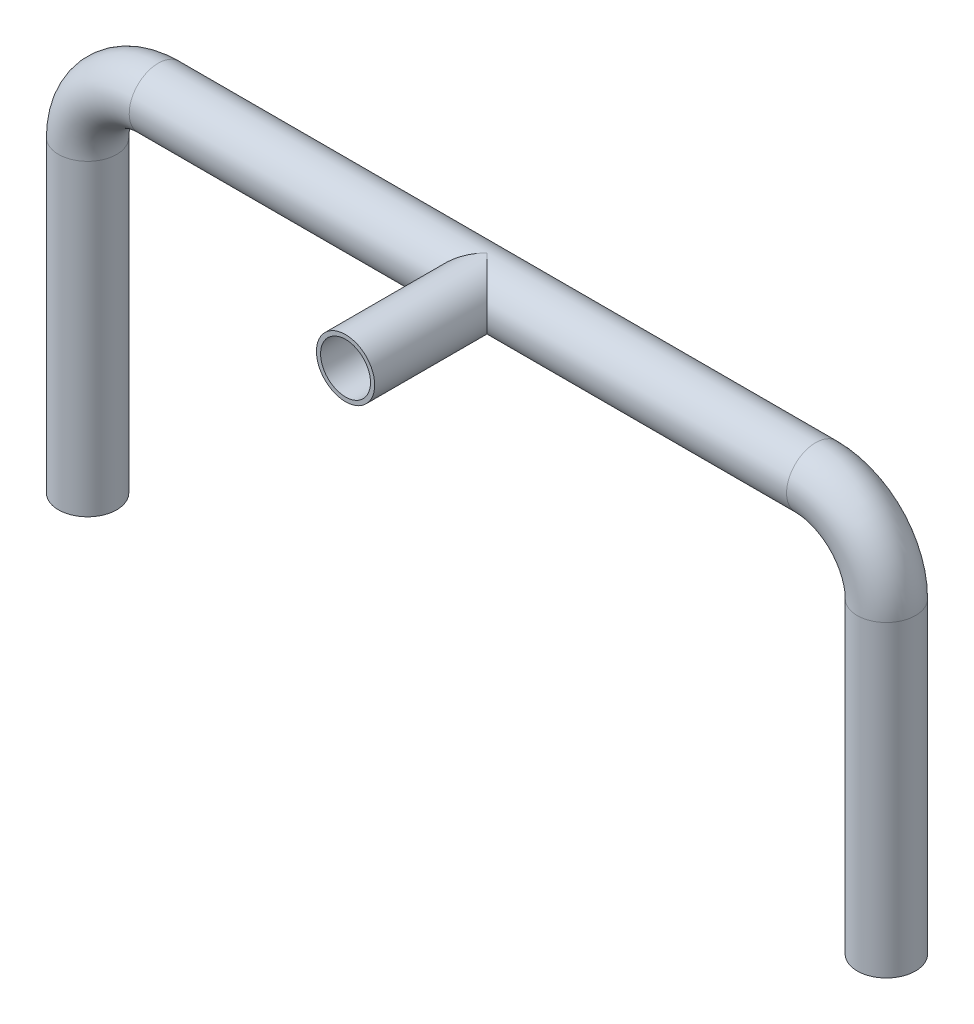
ISO-10303-21;
HEADER;
FILE_DESCRIPTION(('STEP AP214'),'2;1');
FILE_NAME('part.step','',(''),(''),'','','');
FILE_SCHEMA(('AUTOMOTIVE_DESIGN { 1 0 10303 214 1 1 1 1 }'));
ENDSEC;
DATA;
#1=APPLICATION_CONTEXT('core data for automotive mechanical design processes');
#2=APPLICATION_PROTOCOL_DEFINITION('international standard','automotive_design',2000,#1);
#3=PRODUCT_CONTEXT('',#1,'mechanical');
#4=PRODUCT('Part','Part','',(#3));
#5=PRODUCT_RELATED_PRODUCT_CATEGORY('part','',(#4));
#6=PRODUCT_DEFINITION_FORMATION('','',#4);
#7=PRODUCT_DEFINITION_CONTEXT('part definition',#1,'design');
#8=PRODUCT_DEFINITION('design','',#6,#7);
#9=PRODUCT_DEFINITION_SHAPE('','',#8);
#10=(LENGTH_UNIT() NAMED_UNIT(*) SI_UNIT(.MILLI.,.METRE.));
#11=(NAMED_UNIT(*) PLANE_ANGLE_UNIT() SI_UNIT($,.RADIAN.));
#12=(NAMED_UNIT(*) SI_UNIT($,.STERADIAN.) SOLID_ANGLE_UNIT());
#13=UNCERTAINTY_MEASURE_WITH_UNIT(LENGTH_MEASURE(1.E-05),#10,'distance_accuracy_value','');
#14=(GEOMETRIC_REPRESENTATION_CONTEXT(3) GLOBAL_UNCERTAINTY_ASSIGNED_CONTEXT((#13)) GLOBAL_UNIT_ASSIGNED_CONTEXT((#10,
#11,#12)) REPRESENTATION_CONTEXT('',''));
#15=CARTESIAN_POINT('',(0.,0.,0.));
#16=DIRECTION('',(0.,0.,1.));
#17=DIRECTION('',(1.,0.,0.));
#18=AXIS2_PLACEMENT_3D('',#15,#16,#17);
#19=CARTESIAN_POINT('',(0.,0.,0.));
#20=DIRECTION('',(0.,-1.,0.));
#21=DIRECTION('',(0.,0.,1.));
#22=AXIS2_PLACEMENT_3D('',#19,#20,#21);
#23=PLANE('',#22);
#24=CARTESIAN_POINT('',(0.,0.,0.));
#25=DIRECTION('',(0.,-1.,0.));
#26=DIRECTION('',(0.,0.,-1.));
#27=AXIS2_PLACEMENT_3D('',#24,#25,#26);
#28=CIRCLE('',#27,3.);
#29=CARTESIAN_POINT('',(0.,0.,-3.));
#30=VERTEX_POINT('',#29);
#31=EDGE_CURVE('E118',#30,#30,#28,.T.);
#32=ORIENTED_EDGE('',*,*,#31,.F.);
#33=EDGE_LOOP('',(#32));
#34=FACE_BOUND('',#33,.T.);
#35=CARTESIAN_POINT('',(0.,0.,0.));
#36=DIRECTION('',(0.,-1.,0.));
#37=DIRECTION('',(0.,0.,1.));
#38=AXIS2_PLACEMENT_3D('',#35,#36,#37);
#39=CIRCLE('',#38,3.5);
#40=CARTESIAN_POINT('',(0.,0.,3.5));
#41=VERTEX_POINT('',#40);
#42=EDGE_CURVE('E123',#41,#41,#39,.T.);
#43=ORIENTED_EDGE('',*,*,#42,.T.);
#44=EDGE_LOOP('',(#43));
#45=FACE_BOUND('',#44,.T.);
#46=ADVANCED_FACE('F59',(#34,#45),#23,.T.);
#47=CARTESIAN_POINT('',(96.,0.,0.));
#48=DIRECTION('',(0.,1.,0.));
#49=DIRECTION('',(0.,0.,1.));
#50=AXIS2_PLACEMENT_3D('',#47,#48,#49);
#51=PLANE('',#50);
#52=CARTESIAN_POINT('',(96.,0.,0.));
#53=DIRECTION('',(0.,-1.,0.));
#54=DIRECTION('',(0.,0.,-1.));
#55=AXIS2_PLACEMENT_3D('',#52,#53,#54);
#56=CIRCLE('',#55,3.00000000000001);
#57=CARTESIAN_POINT('',(96.,0.,-3.00000000000001));
#58=VERTEX_POINT('',#57);
#59=EDGE_CURVE('E114',#58,#58,#56,.T.);
#60=ORIENTED_EDGE('',*,*,#59,.F.);
#61=EDGE_LOOP('',(#60));
#62=FACE_BOUND('',#61,.T.);
#63=CARTESIAN_POINT('',(96.,0.,0.));
#64=DIRECTION('',(0.,1.,0.));
#65=DIRECTION('',(0.,0.,1.));
#66=AXIS2_PLACEMENT_3D('',#63,#64,#65);
#67=CIRCLE('',#66,3.5);
#68=CARTESIAN_POINT('',(96.,0.,3.5));
#69=VERTEX_POINT('',#68);
#70=EDGE_CURVE('E12',#69,#69,#67,.T.);
#71=ORIENTED_EDGE('',*,*,#70,.F.);
#72=EDGE_LOOP('',(#71));
#73=FACE_BOUND('',#72,.T.);
#74=ADVANCED_FACE('F176',(#62,#73),#51,.F.);
#75=CARTESIAN_POINT('',(0.,0.,0.));
#76=DIRECTION('',(0.,1.,0.));
#77=DIRECTION('',(0.,0.,1.));
#78=AXIS2_PLACEMENT_3D('',#75,#76,#77);
#79=CYLINDRICAL_SURFACE('',#78,3.5);
#80=CARTESIAN_POINT('',(0.,37.,0.));
#81=DIRECTION('',(0.,-1.,0.));
#82=DIRECTION('',(0.,0.,1.));
#83=AXIS2_PLACEMENT_3D('',#80,#81,#82);
#84=CIRCLE('',#83,3.5);
#85=CARTESIAN_POINT('',(-3.5,37.,0.));
#86=VERTEX_POINT('',#85);
#87=EDGE_CURVE('E142',#86,#86,#84,.T.);
#88=ORIENTED_EDGE('',*,*,#87,.T.);
#89=EDGE_LOOP('',(#88));
#90=FACE_BOUND('',#89,.T.);
#91=ORIENTED_EDGE('',*,*,#42,.F.);
#92=EDGE_LOOP('',(#91));
#93=FACE_BOUND('',#92,.T.);
#94=ADVANCED_FACE('F178',(#90,#93),#79,.T.);
#95=CARTESIAN_POINT('',(8.5,37.,0.));
#96=DIRECTION('',(0.,0.,-1.));
#97=DIRECTION('',(-1.,0.,0.));
#98=AXIS2_PLACEMENT_3D('',#95,#96,#97);
#99=TOROIDAL_SURFACE('',#98,8.5,3.5);
#100=CARTESIAN_POINT('',(8.5,45.5,0.));
#101=DIRECTION('',(-1.,0.,0.));
#102=DIRECTION('',(0.,0.,1.));
#103=AXIS2_PLACEMENT_3D('',#100,#101,#102);
#104=CIRCLE('',#103,3.5);
#105=CARTESIAN_POINT('',(8.5,49.,0.));
#106=VERTEX_POINT('',#105);
#107=EDGE_CURVE('E146',#106,#106,#104,.T.);
#108=CARTESIAN_POINT('',(8.5,37.,0.));
#109=DIRECTION('',(0.,0.,-1.));
#110=DIRECTION('',(-1.,0.,0.));
#111=AXIS2_PLACEMENT_3D('',#108,#109,#110);
#112=CIRCLE('',#111,12.);
#113=EDGE_CURVE('',#86,#106,#112,.T.);
#114=ORIENTED_EDGE('',*,*,#87,.F.);
#115=ORIENTED_EDGE('',*,*,#107,.T.);
#116=ORIENTED_EDGE('',*,*,#113,.T.);
#117=ORIENTED_EDGE('',*,*,#113,.F.);
#118=EDGE_LOOP('',(#114,#116,#115,#117));
#119=FACE_BOUND('',#118,.T.);
#120=ADVANCED_FACE('F184',(#119),#99,.T.);
#121=CARTESIAN_POINT('',(8.5,45.5,0.));
#122=DIRECTION('',(1.,0.,0.));
#123=DIRECTION('',(0.,0.,-1.));
#124=AXIS2_PLACEMENT_3D('',#121,#122,#123);
#125=CYLINDRICAL_SURFACE('',#124,3.5);
#126=CARTESIAN_POINT('',(48.,45.5,0.));
#127=DIRECTION('',(0.707106781186547,0.,-0.707106781186547));
#128=DIRECTION('',(0.707106781186547,0.,0.707106781186547));
#129=AXIS2_PLACEMENT_3D('',#126,#127,#128);
#130=ELLIPSE('',#129,4.94974746830584,3.5);
#131=CARTESIAN_POINT('',(48.,49.,0.));
#132=VERTEX_POINT('',#131);
#133=CARTESIAN_POINT('',(48.,42.,0.));
#134=VERTEX_POINT('',#133);
#135=EDGE_CURVE('E106',#132,#134,#130,.T.);
#136=ORIENTED_EDGE('',*,*,#135,.T.);
#137=CARTESIAN_POINT('',(48.,45.5,0.));
#138=DIRECTION('',(0.707106781186547,0.,0.707106781186547));
#139=DIRECTION('',(0.707106781186547,0.,-0.707106781186547));
#140=AXIS2_PLACEMENT_3D('',#137,#138,#139);
#141=ELLIPSE('',#140,4.94974746830584,3.5);
#142=EDGE_CURVE('E80',#134,#132,#141,.F.);
#143=ORIENTED_EDGE('',*,*,#142,.T.);
#144=EDGE_LOOP('',(#136,#143));
#145=FACE_BOUND('',#144,.T.);
#146=CARTESIAN_POINT('',(87.5,45.5,0.));
#147=DIRECTION('',(-1.,0.,0.));
#148=DIRECTION('',(0.,0.,1.));
#149=AXIS2_PLACEMENT_3D('',#146,#147,#148);
#150=CIRCLE('',#149,3.5);
#151=CARTESIAN_POINT('',(87.5,49.,0.));
#152=VERTEX_POINT('',#151);
#153=EDGE_CURVE('E150',#152,#152,#150,.T.);
#154=ORIENTED_EDGE('',*,*,#153,.T.);
#155=EDGE_LOOP('',(#154));
#156=FACE_BOUND('',#155,.T.);
#157=ORIENTED_EDGE('',*,*,#107,.F.);
#158=EDGE_LOOP('',(#157));
#159=FACE_BOUND('',#158,.T.);
#160=ADVANCED_FACE('F173',(#145,#156,#159),#125,.T.);
#161=CARTESIAN_POINT('',(87.5,37.,0.));
#162=DIRECTION('',(0.,0.,-1.));
#163=DIRECTION('',(-1.,0.,0.));
#164=AXIS2_PLACEMENT_3D('',#161,#162,#163);
#165=TOROIDAL_SURFACE('',#164,8.5,3.5);
#166=CARTESIAN_POINT('',(96.,37.,0.));
#167=DIRECTION('',(0.,1.,0.));
#168=DIRECTION('',(0.,0.,1.));
#169=AXIS2_PLACEMENT_3D('',#166,#167,#168);
#170=CIRCLE('',#169,3.5);
#171=CARTESIAN_POINT('',(99.5,37.,0.));
#172=VERTEX_POINT('',#171);
#173=EDGE_CURVE('E67',#172,#172,#170,.T.);
#174=CARTESIAN_POINT('',(87.5,37.,0.));
#175=DIRECTION('',(0.,0.,-1.));
#176=DIRECTION('',(-1.,0.,0.));
#177=AXIS2_PLACEMENT_3D('',#174,#175,#176);
#178=CIRCLE('',#177,12.);
#179=EDGE_CURVE('',#152,#172,#178,.T.);
#180=ORIENTED_EDGE('',*,*,#153,.F.);
#181=ORIENTED_EDGE('',*,*,#173,.T.);
#182=ORIENTED_EDGE('',*,*,#179,.T.);
#183=ORIENTED_EDGE('',*,*,#179,.F.);
#184=EDGE_LOOP('',(#180,#182,#181,#183));
#185=FACE_BOUND('',#184,.T.);
#186=ADVANCED_FACE('F157',(#185),#165,.T.);
#187=CARTESIAN_POINT('',(96.,37.,0.));
#188=DIRECTION('',(0.,-1.,0.));
#189=DIRECTION('',(0.,0.,-1.));
#190=AXIS2_PLACEMENT_3D('',#187,#188,#189);
#191=CYLINDRICAL_SURFACE('',#190,3.5);
#192=ORIENTED_EDGE('',*,*,#70,.T.);
#193=EDGE_LOOP('',(#192));
#194=FACE_BOUND('',#193,.T.);
#195=ORIENTED_EDGE('',*,*,#173,.F.);
#196=EDGE_LOOP('',(#195));
#197=FACE_BOUND('',#196,.T.);
#198=ADVANCED_FACE('F160',(#194,#197),#191,.T.);
#199=CARTESIAN_POINT('',(0.,0.,0.));
#200=DIRECTION('',(0.,1.,0.));
#201=DIRECTION('',(0.,0.,1.));
#202=AXIS2_PLACEMENT_3D('',#199,#200,#201);
#203=CYLINDRICAL_SURFACE('',#202,3.);
#204=CARTESIAN_POINT('',(0.,37.,0.));
#205=DIRECTION('',(0.,1.,0.));
#206=DIRECTION('',(0.,0.,1.));
#207=AXIS2_PLACEMENT_3D('',#204,#205,#206);
#208=CIRCLE('',#207,3.);
#209=CARTESIAN_POINT('',(-3.,37.,0.));
#210=VERTEX_POINT('',#209);
#211=EDGE_CURVE('E132',#210,#210,#208,.F.);
#212=ORIENTED_EDGE('',*,*,#211,.F.);
#213=EDGE_LOOP('',(#212));
#214=FACE_BOUND('',#213,.T.);
#215=ORIENTED_EDGE('',*,*,#31,.T.);
#216=EDGE_LOOP('',(#215));
#217=FACE_BOUND('',#216,.T.);
#218=ADVANCED_FACE('F162',(#214,#217),#203,.F.);
#219=CARTESIAN_POINT('',(8.5,37.,0.));
#220=DIRECTION('',(0.,0.,-1.));
#221=DIRECTION('',(-1.,0.,0.));
#222=AXIS2_PLACEMENT_3D('',#219,#220,#221);
#223=TOROIDAL_SURFACE('',#222,8.5,3.);
#224=CARTESIAN_POINT('',(8.5,45.5,0.));
#225=DIRECTION('',(-1.,0.,0.));
#226=DIRECTION('',(0.,-1.,0.));
#227=AXIS2_PLACEMENT_3D('',#224,#225,#226);
#228=CIRCLE('',#227,3.);
#229=CARTESIAN_POINT('',(8.5,48.5,0.));
#230=VERTEX_POINT('',#229);
#231=EDGE_CURVE('E128',#230,#230,#228,.T.);
#232=CARTESIAN_POINT('',(8.5,37.,0.));
#233=DIRECTION('',(0.,0.,-1.));
#234=DIRECTION('',(-1.,0.,0.));
#235=AXIS2_PLACEMENT_3D('',#232,#233,#234);
#236=CIRCLE('',#235,11.5);
#237=EDGE_CURVE('',#210,#230,#236,.T.);
#238=ORIENTED_EDGE('',*,*,#211,.T.);
#239=ORIENTED_EDGE('',*,*,#231,.F.);
#240=ORIENTED_EDGE('',*,*,#237,.T.);
#241=ORIENTED_EDGE('',*,*,#237,.F.);
#242=EDGE_LOOP('',(#238,#240,#239,#241));
#243=FACE_BOUND('',#242,.T.);
#244=ADVANCED_FACE('F169',(#243),#223,.F.);
#245=CARTESIAN_POINT('',(8.5,45.5,0.));
#246=DIRECTION('',(1.,0.,0.));
#247=DIRECTION('',(0.,0.,-1.));
#248=AXIS2_PLACEMENT_3D('',#245,#246,#247);
#249=CYLINDRICAL_SURFACE('',#248,3.);
#250=CARTESIAN_POINT('',(48.,45.5,0.));
#251=DIRECTION('',(0.707106781186547,0.,0.707106781186547));
#252=DIRECTION('',(0.707106781186547,0.,-0.707106781186547));
#253=AXIS2_PLACEMENT_3D('',#250,#251,#252);
#254=ELLIPSE('',#253,4.24264068711929,3.);
#255=CARTESIAN_POINT('',(48.,42.5,0.));
#256=VERTEX_POINT('',#255);
#257=CARTESIAN_POINT('',(48.,48.5,0.));
#258=VERTEX_POINT('',#257);
#259=EDGE_CURVE('E73',#256,#258,#254,.F.);
#260=ORIENTED_EDGE('',*,*,#259,.F.);
#261=CARTESIAN_POINT('',(48.,45.5,0.));
#262=DIRECTION('',(0.707106781186547,0.,-0.707106781186547));
#263=DIRECTION('',(0.707106781186547,0.,0.707106781186547));
#264=AXIS2_PLACEMENT_3D('',#261,#262,#263);
#265=ELLIPSE('',#264,4.24264068711929,3.);
#266=EDGE_CURVE('E93',#258,#256,#265,.T.);
#267=ORIENTED_EDGE('',*,*,#266,.F.);
#268=EDGE_LOOP('',(#260,#267));
#269=FACE_BOUND('',#268,.T.);
#270=CARTESIAN_POINT('',(87.5,45.5,0.));
#271=DIRECTION('',(1.,0.,0.));
#272=DIRECTION('',(0.,0.,-1.));
#273=AXIS2_PLACEMENT_3D('',#270,#271,#272);
#274=CIRCLE('',#273,3.);
#275=CARTESIAN_POINT('',(87.5,48.5,0.));
#276=VERTEX_POINT('',#275);
#277=EDGE_CURVE('E124',#276,#276,#274,.F.);
#278=ORIENTED_EDGE('',*,*,#277,.F.);
#279=EDGE_LOOP('',(#278));
#280=FACE_BOUND('',#279,.T.);
#281=ORIENTED_EDGE('',*,*,#231,.T.);
#282=EDGE_LOOP('',(#281));
#283=FACE_BOUND('',#282,.T.);
#284=ADVANCED_FACE('F100',(#269,#280,#283),#249,.F.);
#285=CARTESIAN_POINT('',(87.5,37.,0.));
#286=DIRECTION('',(0.,0.,-1.));
#287=DIRECTION('',(-1.,0.,0.));
#288=AXIS2_PLACEMENT_3D('',#285,#286,#287);
#289=TOROIDAL_SURFACE('',#288,8.5,3.);
#290=CARTESIAN_POINT('',(96.,37.,0.));
#291=DIRECTION('',(0.,1.,0.));
#292=DIRECTION('',(-1.,0.,0.));
#293=AXIS2_PLACEMENT_3D('',#290,#291,#292);
#294=CIRCLE('',#293,3.);
#295=CARTESIAN_POINT('',(99.,37.,0.));
#296=VERTEX_POINT('',#295);
#297=EDGE_CURVE('E119',#296,#296,#294,.T.);
#298=CARTESIAN_POINT('',(87.5,37.,0.));
#299=DIRECTION('',(0.,0.,-1.));
#300=DIRECTION('',(-1.,0.,0.));
#301=AXIS2_PLACEMENT_3D('',#298,#299,#300);
#302=CIRCLE('',#301,11.5);
#303=EDGE_CURVE('',#276,#296,#302,.T.);
#304=ORIENTED_EDGE('',*,*,#277,.T.);
#305=ORIENTED_EDGE('',*,*,#297,.F.);
#306=ORIENTED_EDGE('',*,*,#303,.T.);
#307=ORIENTED_EDGE('',*,*,#303,.F.);
#308=EDGE_LOOP('',(#304,#306,#305,#307));
#309=FACE_BOUND('',#308,.T.);
#310=ADVANCED_FACE('F194',(#309),#289,.F.);
#311=CARTESIAN_POINT('',(96.,37.,0.));
#312=DIRECTION('',(0.,-1.,0.));
#313=DIRECTION('',(0.,0.,-1.));
#314=AXIS2_PLACEMENT_3D('',#311,#312,#313);
#315=CYLINDRICAL_SURFACE('',#314,3.);
#316=ORIENTED_EDGE('',*,*,#297,.T.);
#317=EDGE_LOOP('',(#316));
#318=FACE_BOUND('',#317,.T.);
#319=ORIENTED_EDGE('',*,*,#59,.T.);
#320=EDGE_LOOP('',(#319));
#321=FACE_BOUND('',#320,.T.);
#322=ADVANCED_FACE('F188',(#318,#321),#315,.F.);
#323=CARTESIAN_POINT('',(48.,45.5,0.));
#324=DIRECTION('',(0.,0.,1.));
#325=DIRECTION('',(1.,0.,0.));
#326=AXIS2_PLACEMENT_3D('',#323,#324,#325);
#327=CYLINDRICAL_SURFACE('',#326,3.5);
#328=CARTESIAN_POINT('',(48.,45.5,17.));
#329=DIRECTION('',(0.,0.,1.));
#330=DIRECTION('',(1.,0.,0.));
#331=AXIS2_PLACEMENT_3D('',#328,#329,#330);
#332=CIRCLE('',#331,3.5);
#333=CARTESIAN_POINT('',(51.5,45.5,17.));
#334=VERTEX_POINT('',#333);
#335=EDGE_CURVE('E103',#334,#334,#332,.T.);
#336=ORIENTED_EDGE('',*,*,#335,.F.);
#337=EDGE_LOOP('',(#336));
#338=FACE_BOUND('',#337,.T.);
#339=ORIENTED_EDGE('',*,*,#142,.F.);
#340=ORIENTED_EDGE('',*,*,#135,.F.);
#341=EDGE_LOOP('',(#339,#340));
#342=FACE_BOUND('',#341,.T.);
#343=ADVANCED_FACE('F172',(#338,#342),#327,.T.);
#344=CARTESIAN_POINT('',(48.,45.5,17.));
#345=DIRECTION('',(0.,0.,1.));
#346=DIRECTION('',(1.,0.,0.));
#347=AXIS2_PLACEMENT_3D('',#344,#345,#346);
#348=PLANE('',#347);
#349=CARTESIAN_POINT('',(48.,45.5,17.));
#350=DIRECTION('',(0.,0.,1.));
#351=DIRECTION('',(1.,0.,0.));
#352=AXIS2_PLACEMENT_3D('',#349,#350,#351);
#353=CIRCLE('',#352,3.);
#354=CARTESIAN_POINT('',(51.,45.5,17.));
#355=VERTEX_POINT('',#354);
#356=EDGE_CURVE('E98',#355,#355,#353,.T.);
#357=ORIENTED_EDGE('',*,*,#356,.F.);
#358=EDGE_LOOP('',(#357));
#359=FACE_BOUND('',#358,.T.);
#360=ORIENTED_EDGE('',*,*,#335,.T.);
#361=EDGE_LOOP('',(#360));
#362=FACE_BOUND('',#361,.T.);
#363=ADVANCED_FACE('F201',(#359,#362),#348,.T.);
#364=CARTESIAN_POINT('',(48.,45.5,0.));
#365=DIRECTION('',(0.,0.,1.));
#366=DIRECTION('',(1.,0.,0.));
#367=AXIS2_PLACEMENT_3D('',#364,#365,#366);
#368=CYLINDRICAL_SURFACE('',#367,3.);
#369=ORIENTED_EDGE('',*,*,#259,.T.);
#370=ORIENTED_EDGE('',*,*,#266,.T.);
#371=EDGE_LOOP('',(#369,#370));
#372=FACE_BOUND('',#371,.T.);
#373=ORIENTED_EDGE('',*,*,#356,.T.);
#374=EDGE_LOOP('',(#373));
#375=FACE_BOUND('',#374,.T.);
#376=ADVANCED_FACE('F94',(#372,#375),#368,.F.);
#377=CLOSED_SHELL('',(#46,#74,#94,#120,#160,#186,#198,#218,#244,#284,#310,#322,#343,#363,#376));
#378=MANIFOLD_SOLID_BREP('B2',#377);
#379=ADVANCED_BREP_SHAPE_REPRESENTATION('',(#18,#378),#14);
#380=SHAPE_DEFINITION_REPRESENTATION(#9,#379);
ENDSEC;
END-ISO-10303-21;
